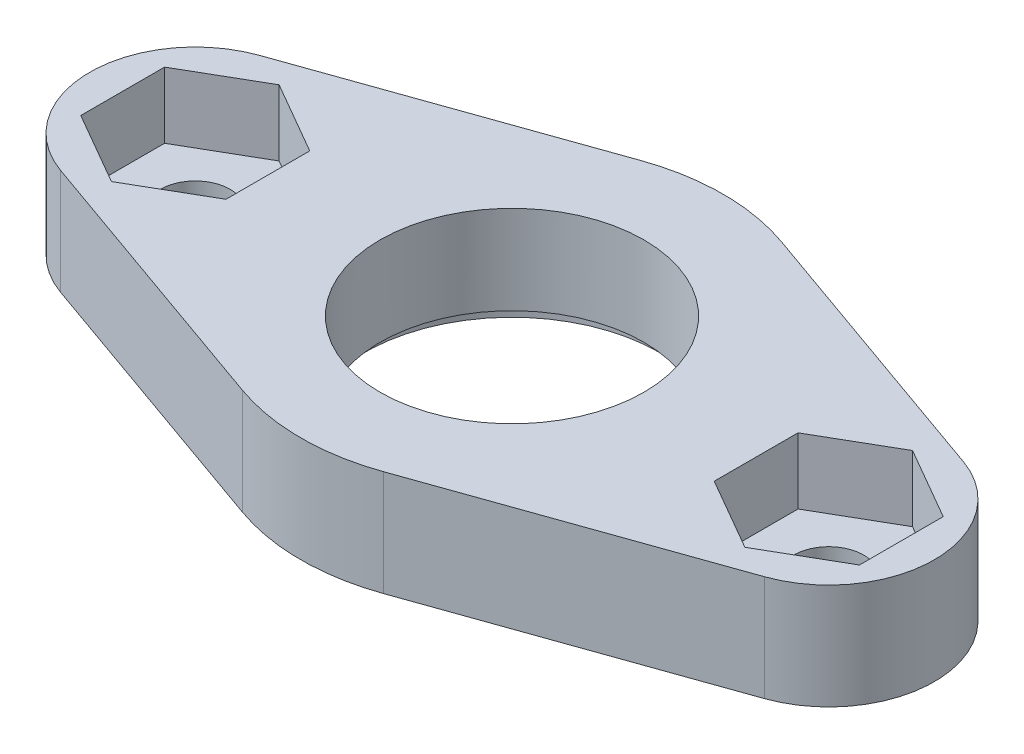
ISO-10303-21;
HEADER;
FILE_DESCRIPTION(('STEP AP214'),'2;1');
FILE_NAME('part.step','',(''),(''),'','','');
FILE_SCHEMA(('AUTOMOTIVE_DESIGN { 1 0 10303 214 1 1 1 1 }'));
ENDSEC;
DATA;
#1=APPLICATION_CONTEXT('core data for automotive mechanical design processes');
#2=APPLICATION_PROTOCOL_DEFINITION('international standard','automotive_design',2000,#1);
#3=PRODUCT_CONTEXT('',#1,'mechanical');
#4=PRODUCT('Part','Part','',(#3));
#5=PRODUCT_RELATED_PRODUCT_CATEGORY('part','',(#4));
#6=PRODUCT_DEFINITION_FORMATION('','',#4);
#7=PRODUCT_DEFINITION_CONTEXT('part definition',#1,'design');
#8=PRODUCT_DEFINITION('design','',#6,#7);
#9=PRODUCT_DEFINITION_SHAPE('','',#8);
#10=(LENGTH_UNIT() NAMED_UNIT(*) SI_UNIT(.MILLI.,.METRE.));
#11=(NAMED_UNIT(*) PLANE_ANGLE_UNIT() SI_UNIT($,.RADIAN.));
#12=(NAMED_UNIT(*) SI_UNIT($,.STERADIAN.) SOLID_ANGLE_UNIT());
#13=UNCERTAINTY_MEASURE_WITH_UNIT(LENGTH_MEASURE(1.E-05),#10,'distance_accuracy_value','');
#14=(GEOMETRIC_REPRESENTATION_CONTEXT(3) GLOBAL_UNCERTAINTY_ASSIGNED_CONTEXT((#13)) GLOBAL_UNIT_ASSIGNED_CONTEXT((#10,
#11,#12)) REPRESENTATION_CONTEXT('',''));
#15=CARTESIAN_POINT('',(0.,0.,0.));
#16=DIRECTION('',(0.,0.,1.));
#17=DIRECTION('',(1.,0.,0.));
#18=AXIS2_PLACEMENT_3D('',#15,#16,#17);
#19=CARTESIAN_POINT('',(19.05,6.35,0.));
#20=DIRECTION('',(0.,-1.,0.));
#21=DIRECTION('',(0.,0.,-1.));
#22=AXIS2_PLACEMENT_3D('',#19,#20,#21);
#23=CYLINDRICAL_SURFACE('',#22,2.0955);
#24=CARTESIAN_POINT('',(19.05,0.,0.));
#25=DIRECTION('',(0.,1.,0.));
#26=DIRECTION('',(0.,0.,1.));
#27=AXIS2_PLACEMENT_3D('',#24,#25,#26);
#28=CIRCLE('',#27,2.0955);
#29=CARTESIAN_POINT('',(19.05,0.,2.0955));
#30=VERTEX_POINT('',#29);
#31=EDGE_CURVE('E409',#30,#30,#28,.T.);
#32=ORIENTED_EDGE('',*,*,#31,.F.);
#33=EDGE_LOOP('',(#32));
#34=FACE_BOUND('',#33,.T.);
#35=CARTESIAN_POINT('',(19.05,2.38125,0.));
#36=DIRECTION('',(0.,1.,0.));
#37=DIRECTION('',(0.,0.,1.));
#38=AXIS2_PLACEMENT_3D('',#35,#36,#37);
#39=CIRCLE('',#38,2.0955);
#40=CARTESIAN_POINT('',(19.05,2.38125,2.0955));
#41=VERTEX_POINT('',#40);
#42=EDGE_CURVE('E48',#41,#41,#39,.T.);
#43=ORIENTED_EDGE('',*,*,#42,.T.);
#44=EDGE_LOOP('',(#43));
#45=FACE_BOUND('',#44,.T.);
#46=ADVANCED_FACE('F44',(#34,#45),#23,.F.);
#47=CARTESIAN_POINT('',(-19.05,6.35,0.));
#48=DIRECTION('',(0.,-1.,0.));
#49=DIRECTION('',(0.,0.,-1.));
#50=AXIS2_PLACEMENT_3D('',#47,#48,#49);
#51=CYLINDRICAL_SURFACE('',#50,2.0955);
#52=CARTESIAN_POINT('',(-19.05,0.,0.));
#53=DIRECTION('',(0.,1.,0.));
#54=DIRECTION('',(0.,0.,1.));
#55=AXIS2_PLACEMENT_3D('',#52,#53,#54);
#56=CIRCLE('',#55,2.0955);
#57=CARTESIAN_POINT('',(-19.05,0.,2.0955));
#58=VERTEX_POINT('',#57);
#59=EDGE_CURVE('E405',#58,#58,#56,.T.);
#60=ORIENTED_EDGE('',*,*,#59,.F.);
#61=EDGE_LOOP('',(#60));
#62=FACE_BOUND('',#61,.T.);
#63=CARTESIAN_POINT('',(-19.05,2.38125,0.));
#64=DIRECTION('',(0.,1.,0.));
#65=DIRECTION('',(0.,0.,1.));
#66=AXIS2_PLACEMENT_3D('',#63,#64,#65);
#67=CIRCLE('',#66,2.0955);
#68=CARTESIAN_POINT('',(-19.05,2.38125,2.0955));
#69=VERTEX_POINT('',#68);
#70=EDGE_CURVE('E287',#69,#69,#67,.T.);
#71=ORIENTED_EDGE('',*,*,#70,.T.);
#72=EDGE_LOOP('',(#71));
#73=FACE_BOUND('',#72,.T.);
#74=ADVANCED_FACE('F562',(#62,#73),#51,.F.);
#75=CARTESIAN_POINT('',(0.,6.35,0.));
#76=DIRECTION('',(0.,-1.,0.));
#77=DIRECTION('',(0.,0.,-1.));
#78=AXIS2_PLACEMENT_3D('',#75,#76,#77);
#79=CYLINDRICAL_SURFACE('',#78,7.9375);
#80=CARTESIAN_POINT('',(0.,6.35,0.));
#81=DIRECTION('',(0.,1.,0.));
#82=DIRECTION('',(0.,0.,1.));
#83=AXIS2_PLACEMENT_3D('',#80,#81,#82);
#84=CIRCLE('',#83,7.9375);
#85=CARTESIAN_POINT('',(0.,6.35,7.9375));
#86=VERTEX_POINT('',#85);
#87=EDGE_CURVE('E371',#86,#86,#84,.T.);
#88=ORIENTED_EDGE('',*,*,#87,.T.);
#89=EDGE_LOOP('',(#88));
#90=FACE_BOUND('',#89,.T.);
#91=CARTESIAN_POINT('',(0.,1.016,0.));
#92=DIRECTION('',(0.,-1.,0.));
#93=DIRECTION('',(0.,0.,-1.));
#94=AXIS2_PLACEMENT_3D('',#91,#92,#93);
#95=CIRCLE('',#94,7.9375);
#96=CARTESIAN_POINT('',(0.,1.016,-7.9375));
#97=VERTEX_POINT('',#96);
#98=EDGE_CURVE('E366',#97,#97,#95,.T.);
#99=ORIENTED_EDGE('',*,*,#98,.T.);
#100=EDGE_LOOP('',(#99));
#101=FACE_BOUND('',#100,.T.);
#102=ADVANCED_FACE('F46',(#90,#101),#79,.F.);
#103=CARTESIAN_POINT('',(-4.23333333333335,6.35,11.9736748280922));
#104=DIRECTION('',(0.333333333333334,0.,-0.942809041582063));
#105=DIRECTION('',(-0.942809041582063,0.,-0.333333333333334));
#106=AXIS2_PLACEMENT_3D('',#103,#104,#105);
#107=PLANE('',#106);
#108=DIRECTION('',(0.942809041582063,0.,0.333333333333334));
#109=VECTOR('',#108,1.);
#110=CARTESIAN_POINT('',(-4.23333333333335,0.,11.9736748280922));
#111=LINE('',#110,#109);
#112=CARTESIAN_POINT('',(-21.1666666666667,0.,5.9868374140461));
#113=VERTEX_POINT('',#112);
#114=CARTESIAN_POINT('',(-4.23333333333335,0.,11.9736748280922));
#115=VERTEX_POINT('',#114);
#116=EDGE_CURVE('E413',#113,#115,#111,.T.);
#117=ORIENTED_EDGE('',*,*,#116,.T.);
#118=DIRECTION('',(0.,-1.,0.));
#119=VECTOR('',#118,1.);
#120=CARTESIAN_POINT('',(-4.23333333333335,6.35,11.9736748280922));
#121=LINE('',#120,#119);
#122=CARTESIAN_POINT('',(-4.23333333333335,6.35,11.9736748280922));
#123=VERTEX_POINT('',#122);
#124=EDGE_CURVE('E11',#123,#115,#121,.T.);
#125=ORIENTED_EDGE('',*,*,#124,.F.);
#126=DIRECTION('',(0.942809041582063,0.,0.333333333333334));
#127=VECTOR('',#126,1.);
#128=CARTESIAN_POINT('',(-4.23333333333335,6.35,11.9736748280922));
#129=LINE('',#128,#127);
#130=CARTESIAN_POINT('',(-21.1666666666667,6.35,5.9868374140461));
#131=VERTEX_POINT('',#130);
#132=EDGE_CURVE('E375',#131,#123,#129,.T.);
#133=ORIENTED_EDGE('',*,*,#132,.F.);
#134=DIRECTION('',(0.,-1.,0.));
#135=VECTOR('',#134,1.);
#136=CARTESIAN_POINT('',(-21.1666666666667,6.35,5.9868374140461));
#137=LINE('',#136,#135);
#138=EDGE_CURVE('E404',#131,#113,#137,.T.);
#139=ORIENTED_EDGE('',*,*,#138,.T.);
#140=EDGE_LOOP('',(#117,#125,#133,#139));
#141=FACE_BOUND('',#140,.T.);
#142=ADVANCED_FACE('F521',(#141),#107,.F.);
#143=CARTESIAN_POINT('',(0.,6.35,0.));
#144=DIRECTION('',(0.,-1.,0.));
#145=DIRECTION('',(0.,0.,-1.));
#146=AXIS2_PLACEMENT_3D('',#143,#144,#145);
#147=CYLINDRICAL_SURFACE('',#146,12.7);
#148=CARTESIAN_POINT('',(0.,0.,0.));
#149=DIRECTION('',(0.,1.,0.));
#150=DIRECTION('',(0.,0.,1.));
#151=AXIS2_PLACEMENT_3D('',#148,#149,#150);
#152=CIRCLE('',#151,12.7);
#153=CARTESIAN_POINT('',(4.23333333333335,0.,11.9736748280922));
#154=VERTEX_POINT('',#153);
#155=EDGE_CURVE('E417',#115,#154,#152,.T.);
#156=ORIENTED_EDGE('',*,*,#155,.T.);
#157=DIRECTION('',(0.,-1.,0.));
#158=VECTOR('',#157,1.);
#159=CARTESIAN_POINT('',(4.23333333333335,6.35,11.9736748280922));
#160=LINE('',#159,#158);
#161=CARTESIAN_POINT('',(4.23333333333335,6.35,11.9736748280922));
#162=VERTEX_POINT('',#161);
#163=EDGE_CURVE('E54',#162,#154,#160,.T.);
#164=ORIENTED_EDGE('',*,*,#163,.F.);
#165=CARTESIAN_POINT('',(0.,6.35,0.));
#166=DIRECTION('',(0.,1.,0.));
#167=DIRECTION('',(0.,0.,1.));
#168=AXIS2_PLACEMENT_3D('',#165,#166,#167);
#169=CIRCLE('',#168,12.7);
#170=EDGE_CURVE('E380',#123,#162,#169,.T.);
#171=ORIENTED_EDGE('',*,*,#170,.F.);
#172=ORIENTED_EDGE('',*,*,#124,.T.);
#173=EDGE_LOOP('',(#156,#164,#171,#172));
#174=FACE_BOUND('',#173,.T.);
#175=ADVANCED_FACE('F524',(#174),#147,.T.);
#176=CARTESIAN_POINT('',(4.23333333333335,6.35,11.9736748280922));
#177=DIRECTION('',(0.333333333333334,0.,0.942809041582063));
#178=DIRECTION('',(0.942809041582063,0.,-0.333333333333334));
#179=AXIS2_PLACEMENT_3D('',#176,#177,#178);
#180=PLANE('',#179);
#181=DIRECTION('',(-0.942809041582063,0.,0.333333333333334));
#182=VECTOR('',#181,1.);
#183=CARTESIAN_POINT('',(4.23333333333335,0.,11.9736748280922));
#184=LINE('',#183,#182);
#185=CARTESIAN_POINT('',(21.1666666666667,0.,5.9868374140461));
#186=VERTEX_POINT('',#185);
#187=EDGE_CURVE('E421',#186,#154,#184,.T.);
#188=ORIENTED_EDGE('',*,*,#187,.F.);
#189=DIRECTION('',(0.,-1.,0.));
#190=VECTOR('',#189,1.);
#191=CARTESIAN_POINT('',(21.1666666666667,6.35,5.9868374140461));
#192=LINE('',#191,#190);
#193=CARTESIAN_POINT('',(21.1666666666667,6.35,5.9868374140461));
#194=VERTEX_POINT('',#193);
#195=EDGE_CURVE('E458',#194,#186,#192,.T.);
#196=ORIENTED_EDGE('',*,*,#195,.F.);
#197=DIRECTION('',(-0.942809041582063,0.,0.333333333333334));
#198=VECTOR('',#197,1.);
#199=CARTESIAN_POINT('',(4.23333333333335,6.35,11.9736748280922));
#200=LINE('',#199,#198);
#201=EDGE_CURVE('E383',#194,#162,#200,.T.);
#202=ORIENTED_EDGE('',*,*,#201,.T.);
#203=ORIENTED_EDGE('',*,*,#163,.T.);
#204=EDGE_LOOP('',(#188,#196,#202,#203));
#205=FACE_BOUND('',#204,.T.);
#206=ADVANCED_FACE('F527',(#205),#180,.T.);
#207=CARTESIAN_POINT('',(19.05,6.35,0.));
#208=DIRECTION('',(0.,-1.,0.));
#209=DIRECTION('',(0.,0.,-1.));
#210=AXIS2_PLACEMENT_3D('',#207,#208,#209);
#211=CYLINDRICAL_SURFACE('',#210,6.35);
#212=CARTESIAN_POINT('',(19.05,0.,0.));
#213=DIRECTION('',(0.,1.,0.));
#214=DIRECTION('',(0.,0.,1.));
#215=AXIS2_PLACEMENT_3D('',#212,#213,#214);
#216=CIRCLE('',#215,6.35);
#217=CARTESIAN_POINT('',(21.1666666666667,0.,-5.9868374140461));
#218=VERTEX_POINT('',#217);
#219=EDGE_CURVE('E425',#186,#218,#216,.T.);
#220=ORIENTED_EDGE('',*,*,#219,.T.);
#221=DIRECTION('',(0.,-1.,0.));
#222=VECTOR('',#221,1.);
#223=CARTESIAN_POINT('',(21.1666666666667,6.35,-5.9868374140461));
#224=LINE('',#223,#222);
#225=CARTESIAN_POINT('',(21.1666666666667,6.35,-5.9868374140461));
#226=VERTEX_POINT('',#225);
#227=EDGE_CURVE('E455',#226,#218,#224,.T.);
#228=ORIENTED_EDGE('',*,*,#227,.F.);
#229=CARTESIAN_POINT('',(19.05,6.35,0.));
#230=DIRECTION('',(0.,1.,0.));
#231=DIRECTION('',(0.,0.,1.));
#232=AXIS2_PLACEMENT_3D('',#229,#230,#231);
#233=CIRCLE('',#232,6.35);
#234=EDGE_CURVE('E387',#194,#226,#233,.T.);
#235=ORIENTED_EDGE('',*,*,#234,.F.);
#236=ORIENTED_EDGE('',*,*,#195,.T.);
#237=EDGE_LOOP('',(#220,#228,#235,#236));
#238=FACE_BOUND('',#237,.T.);
#239=ADVANCED_FACE('F532',(#238),#211,.T.);
#240=CARTESIAN_POINT('',(4.23333333333335,6.35,-11.9736748280922));
#241=DIRECTION('',(0.333333333333334,0.,-0.942809041582063));
#242=DIRECTION('',(-0.942809041582063,0.,-0.333333333333334));
#243=AXIS2_PLACEMENT_3D('',#240,#241,#242);
#244=PLANE('',#243);
#245=DIRECTION('',(0.942809041582063,0.,0.333333333333334));
#246=VECTOR('',#245,1.);
#247=CARTESIAN_POINT('',(4.23333333333335,0.,-11.9736748280922));
#248=LINE('',#247,#246);
#249=CARTESIAN_POINT('',(4.23333333333335,0.,-11.9736748280922));
#250=VERTEX_POINT('',#249);
#251=EDGE_CURVE('E429',#250,#218,#248,.T.);
#252=ORIENTED_EDGE('',*,*,#251,.F.);
#253=DIRECTION('',(0.,-1.,0.));
#254=VECTOR('',#253,1.);
#255=CARTESIAN_POINT('',(4.23333333333335,6.35,-11.9736748280922));
#256=LINE('',#255,#254);
#257=CARTESIAN_POINT('',(4.23333333333335,6.35,-11.9736748280922));
#258=VERTEX_POINT('',#257);
#259=EDGE_CURVE('E452',#258,#250,#256,.T.);
#260=ORIENTED_EDGE('',*,*,#259,.F.);
#261=DIRECTION('',(0.942809041582063,0.,0.333333333333334));
#262=VECTOR('',#261,1.);
#263=CARTESIAN_POINT('',(4.23333333333335,6.35,-11.9736748280922));
#264=LINE('',#263,#262);
#265=EDGE_CURVE('E390',#258,#226,#264,.T.);
#266=ORIENTED_EDGE('',*,*,#265,.T.);
#267=ORIENTED_EDGE('',*,*,#227,.T.);
#268=EDGE_LOOP('',(#252,#260,#266,#267));
#269=FACE_BOUND('',#268,.T.);
#270=ADVANCED_FACE('F536',(#269),#244,.T.);
#271=CARTESIAN_POINT('',(0.,6.35,0.));
#272=DIRECTION('',(0.,-1.,0.));
#273=DIRECTION('',(0.,0.,-1.));
#274=AXIS2_PLACEMENT_3D('',#271,#272,#273);
#275=CYLINDRICAL_SURFACE('',#274,12.7);
#276=CARTESIAN_POINT('',(0.,0.,0.));
#277=DIRECTION('',(0.,1.,0.));
#278=DIRECTION('',(0.,0.,1.));
#279=AXIS2_PLACEMENT_3D('',#276,#277,#278);
#280=CIRCLE('',#279,12.7);
#281=CARTESIAN_POINT('',(-4.23333333333335,0.,-11.9736748280922));
#282=VERTEX_POINT('',#281);
#283=EDGE_CURVE('E433',#250,#282,#280,.T.);
#284=ORIENTED_EDGE('',*,*,#283,.T.);
#285=DIRECTION('',(0.,-1.,0.));
#286=VECTOR('',#285,1.);
#287=CARTESIAN_POINT('',(-4.23333333333335,6.35,-11.9736748280922));
#288=LINE('',#287,#286);
#289=CARTESIAN_POINT('',(-4.23333333333335,6.35,-11.9736748280922));
#290=VERTEX_POINT('',#289);
#291=EDGE_CURVE('E449',#290,#282,#288,.T.);
#292=ORIENTED_EDGE('',*,*,#291,.F.);
#293=CARTESIAN_POINT('',(0.,6.35,0.));
#294=DIRECTION('',(0.,1.,0.));
#295=DIRECTION('',(0.,0.,1.));
#296=AXIS2_PLACEMENT_3D('',#293,#294,#295);
#297=CIRCLE('',#296,12.7);
#298=EDGE_CURVE('E394',#258,#290,#297,.T.);
#299=ORIENTED_EDGE('',*,*,#298,.F.);
#300=ORIENTED_EDGE('',*,*,#259,.T.);
#301=EDGE_LOOP('',(#284,#292,#299,#300));
#302=FACE_BOUND('',#301,.T.);
#303=ADVANCED_FACE('F541',(#302),#275,.T.);
#304=CARTESIAN_POINT('',(-4.23333333333335,6.35,-11.9736748280922));
#305=DIRECTION('',(-0.333333333333334,0.,-0.942809041582063));
#306=DIRECTION('',(-0.942809041582063,0.,0.333333333333334));
#307=AXIS2_PLACEMENT_3D('',#304,#305,#306);
#308=PLANE('',#307);
#309=DIRECTION('',(0.942809041582063,0.,-0.333333333333334));
#310=VECTOR('',#309,1.);
#311=CARTESIAN_POINT('',(-4.23333333333335,0.,-11.9736748280922));
#312=LINE('',#311,#310);
#313=CARTESIAN_POINT('',(-21.1666666666667,0.,-5.9868374140461));
#314=VERTEX_POINT('',#313);
#315=EDGE_CURVE('E437',#314,#282,#312,.T.);
#316=ORIENTED_EDGE('',*,*,#315,.F.);
#317=DIRECTION('',(0.,-1.,0.));
#318=VECTOR('',#317,1.);
#319=CARTESIAN_POINT('',(-21.1666666666667,6.35,-5.9868374140461));
#320=LINE('',#319,#318);
#321=CARTESIAN_POINT('',(-21.1666666666667,6.35,-5.9868374140461));
#322=VERTEX_POINT('',#321);
#323=EDGE_CURVE('E446',#322,#314,#320,.T.);
#324=ORIENTED_EDGE('',*,*,#323,.F.);
#325=DIRECTION('',(0.942809041582063,0.,-0.333333333333334));
#326=VECTOR('',#325,1.);
#327=CARTESIAN_POINT('',(-4.23333333333335,6.35,-11.9736748280922));
#328=LINE('',#327,#326);
#329=EDGE_CURVE('E397',#322,#290,#328,.T.);
#330=ORIENTED_EDGE('',*,*,#329,.T.);
#331=ORIENTED_EDGE('',*,*,#291,.T.);
#332=EDGE_LOOP('',(#316,#324,#330,#331));
#333=FACE_BOUND('',#332,.T.);
#334=ADVANCED_FACE('F544',(#333),#308,.T.);
#335=CARTESIAN_POINT('',(-19.05,6.35,0.));
#336=DIRECTION('',(0.,-1.,0.));
#337=DIRECTION('',(0.,0.,-1.));
#338=AXIS2_PLACEMENT_3D('',#335,#336,#337);
#339=CYLINDRICAL_SURFACE('',#338,6.35);
#340=CARTESIAN_POINT('',(-19.05,0.,0.));
#341=DIRECTION('',(0.,1.,0.));
#342=DIRECTION('',(0.,0.,1.));
#343=AXIS2_PLACEMENT_3D('',#340,#341,#342);
#344=CIRCLE('',#343,6.35);
#345=EDGE_CURVE('E376',#314,#113,#344,.T.);
#346=ORIENTED_EDGE('',*,*,#345,.T.);
#347=ORIENTED_EDGE('',*,*,#138,.F.);
#348=CARTESIAN_POINT('',(-19.05,6.35,0.));
#349=DIRECTION('',(0.,1.,0.));
#350=DIRECTION('',(0.,0.,1.));
#351=AXIS2_PLACEMENT_3D('',#348,#349,#350);
#352=CIRCLE('',#351,6.35);
#353=EDGE_CURVE('E401',#322,#131,#352,.T.);
#354=ORIENTED_EDGE('',*,*,#353,.F.);
#355=ORIENTED_EDGE('',*,*,#323,.T.);
#356=EDGE_LOOP('',(#346,#347,#354,#355));
#357=FACE_BOUND('',#356,.T.);
#358=ADVANCED_FACE('F508',(#357),#339,.T.);
#359=CARTESIAN_POINT('',(0.,6.35,0.));
#360=DIRECTION('',(0.,1.,0.));
#361=DIRECTION('',(0.,0.,1.));
#362=AXIS2_PLACEMENT_3D('',#359,#360,#361);
#363=PLANE('',#362);
#364=DIRECTION('',(-0.866025403784438,0.,0.5));
#365=VECTOR('',#364,1.);
#366=CARTESIAN_POINT('',(-19.05,6.35,-5.04098953786192));
#367=LINE('',#366,#365);
#368=CARTESIAN_POINT('',(-19.05,6.35,-5.04098953786192));
#369=VERTEX_POINT('',#368);
#370=CARTESIAN_POINT('',(-23.415625,6.35,-2.52049476893096));
#371=VERTEX_POINT('',#370);
#372=EDGE_CURVE('E65',#369,#371,#367,.T.);
#373=ORIENTED_EDGE('',*,*,#372,.F.);
#374=DIRECTION('',(-0.866025403784439,0.,-0.5));
#375=VECTOR('',#374,1.);
#376=CARTESIAN_POINT('',(-14.684375,6.35,-2.52049476893096));
#377=LINE('',#376,#375);
#378=CARTESIAN_POINT('',(-14.684375,6.35,-2.52049476893096));
#379=VERTEX_POINT('',#378);
#380=EDGE_CURVE('E248',#379,#369,#377,.T.);
#381=ORIENTED_EDGE('',*,*,#380,.F.);
#382=DIRECTION('',(0.,0.,-1.));
#383=VECTOR('',#382,1.);
#384=CARTESIAN_POINT('',(-14.684375,6.35,2.52049476893096));
#385=LINE('',#384,#383);
#386=CARTESIAN_POINT('',(-14.684375,6.35,2.52049476893096));
#387=VERTEX_POINT('',#386);
#388=EDGE_CURVE('E254',#387,#379,#385,.T.);
#389=ORIENTED_EDGE('',*,*,#388,.F.);
#390=DIRECTION('',(0.866025403784438,0.,-0.5));
#391=VECTOR('',#390,1.);
#392=CARTESIAN_POINT('',(-19.05,6.35,5.04098953786192));
#393=LINE('',#392,#391);
#394=CARTESIAN_POINT('',(-19.05,6.35,5.04098953786192));
#395=VERTEX_POINT('',#394);
#396=EDGE_CURVE('E278',#395,#387,#393,.T.);
#397=ORIENTED_EDGE('',*,*,#396,.F.);
#398=DIRECTION('',(0.866025403784439,0.,0.5));
#399=VECTOR('',#398,1.);
#400=CARTESIAN_POINT('',(-23.415625,6.35,2.52049476893096));
#401=LINE('',#400,#399);
#402=CARTESIAN_POINT('',(-23.415625,6.35,2.52049476893096));
#403=VERTEX_POINT('',#402);
#404=EDGE_CURVE('E274',#403,#395,#401,.T.);
#405=ORIENTED_EDGE('',*,*,#404,.F.);
#406=DIRECTION('',(0.,0.,1.));
#407=VECTOR('',#406,1.);
#408=CARTESIAN_POINT('',(-23.415625,6.35,-2.52049476893096));
#409=LINE('',#408,#407);
#410=EDGE_CURVE('E270',#371,#403,#409,.T.);
#411=ORIENTED_EDGE('',*,*,#410,.F.);
#412=EDGE_LOOP('',(#373,#381,#389,#397,#405,#411));
#413=FACE_BOUND('',#412,.T.);
#414=DIRECTION('',(-0.866025403784439,0.,-0.5));
#415=VECTOR('',#414,1.);
#416=CARTESIAN_POINT('',(23.415625,6.35,-2.52049476893097));
#417=LINE('',#416,#415);
#418=CARTESIAN_POINT('',(23.415625,6.35,-2.52049476893097));
#419=VERTEX_POINT('',#418);
#420=CARTESIAN_POINT('',(19.05,6.35,-5.04098953786192));
#421=VERTEX_POINT('',#420);
#422=EDGE_CURVE('E76',#419,#421,#417,.T.);
#423=ORIENTED_EDGE('',*,*,#422,.F.);
#424=DIRECTION('',(0.,0.,-1.));
#425=VECTOR('',#424,1.);
#426=CARTESIAN_POINT('',(23.415625,6.35,2.52049476893095));
#427=LINE('',#426,#425);
#428=CARTESIAN_POINT('',(23.415625,6.35,2.52049476893095));
#429=VERTEX_POINT('',#428);
#430=EDGE_CURVE('E304',#429,#419,#427,.T.);
#431=ORIENTED_EDGE('',*,*,#430,.F.);
#432=DIRECTION('',(0.866025403784439,0.,-0.5));
#433=VECTOR('',#432,1.);
#434=CARTESIAN_POINT('',(19.05,6.35,5.04098953786191));
#435=LINE('',#434,#433);
#436=CARTESIAN_POINT('',(19.05,6.35,5.04098953786191));
#437=VERTEX_POINT('',#436);
#438=EDGE_CURVE('E339',#437,#429,#435,.T.);
#439=ORIENTED_EDGE('',*,*,#438,.F.);
#440=DIRECTION('',(0.866025403784439,0.,0.499999999999999));
#441=VECTOR('',#440,1.);
#442=CARTESIAN_POINT('',(14.684375,6.35,2.52049476893096));
#443=LINE('',#442,#441);
#444=CARTESIAN_POINT('',(14.684375,6.35,2.52049476893096));
#445=VERTEX_POINT('',#444);
#446=EDGE_CURVE('E335',#445,#437,#443,.T.);
#447=ORIENTED_EDGE('',*,*,#446,.F.);
#448=DIRECTION('',(0.,0.,1.));
#449=VECTOR('',#448,1.);
#450=CARTESIAN_POINT('',(14.684375,6.35,-2.52049476893096));
#451=LINE('',#450,#449);
#452=CARTESIAN_POINT('',(14.684375,6.35,-2.52049476893096));
#453=VERTEX_POINT('',#452);
#454=EDGE_CURVE('E331',#453,#445,#451,.T.);
#455=ORIENTED_EDGE('',*,*,#454,.F.);
#456=DIRECTION('',(-0.866025403784439,0.,0.5));
#457=VECTOR('',#456,1.);
#458=CARTESIAN_POINT('',(19.05,6.35,-5.04098953786192));
#459=LINE('',#458,#457);
#460=EDGE_CURVE('E327',#421,#453,#459,.T.);
#461=ORIENTED_EDGE('',*,*,#460,.F.);
#462=EDGE_LOOP('',(#423,#431,#439,#447,#455,#461));
#463=FACE_BOUND('',#462,.T.);
#464=ORIENTED_EDGE('',*,*,#87,.F.);
#465=EDGE_LOOP('',(#464));
#466=FACE_BOUND('',#465,.T.);
#467=ORIENTED_EDGE('',*,*,#132,.T.);
#468=ORIENTED_EDGE('',*,*,#170,.T.);
#469=ORIENTED_EDGE('',*,*,#201,.F.);
#470=ORIENTED_EDGE('',*,*,#234,.T.);
#471=ORIENTED_EDGE('',*,*,#265,.F.);
#472=ORIENTED_EDGE('',*,*,#298,.T.);
#473=ORIENTED_EDGE('',*,*,#329,.F.);
#474=ORIENTED_EDGE('',*,*,#353,.T.);
#475=EDGE_LOOP('',(#467,#468,#469,#470,#471,#472,#473,#474));
#476=FACE_BOUND('',#475,.T.);
#477=ADVANCED_FACE('F504',(#413,#463,#466,#476),#363,.T.);
#478=CARTESIAN_POINT('',(0.,0.,0.));
#479=DIRECTION('',(0.,1.,0.));
#480=DIRECTION('',(0.,0.,1.));
#481=AXIS2_PLACEMENT_3D('',#478,#479,#480);
#482=PLANE('',#481);
#483=CARTESIAN_POINT('',(0.,0.,0.));
#484=DIRECTION('',(0.,-1.,0.));
#485=DIRECTION('',(0.,0.,-1.));
#486=AXIS2_PLACEMENT_3D('',#483,#484,#485);
#487=CIRCLE('',#486,8.89);
#488=CARTESIAN_POINT('',(0.,0.,-8.89));
#489=VERTEX_POINT('',#488);
#490=EDGE_CURVE('E367',#489,#489,#487,.T.);
#491=ORIENTED_EDGE('',*,*,#490,.F.);
#492=EDGE_LOOP('',(#491));
#493=FACE_BOUND('',#492,.T.);
#494=ORIENTED_EDGE('',*,*,#59,.T.);
#495=EDGE_LOOP('',(#494));
#496=FACE_BOUND('',#495,.T.);
#497=ORIENTED_EDGE('',*,*,#31,.T.);
#498=EDGE_LOOP('',(#497));
#499=FACE_BOUND('',#498,.T.);
#500=ORIENTED_EDGE('',*,*,#116,.F.);
#501=ORIENTED_EDGE('',*,*,#345,.F.);
#502=ORIENTED_EDGE('',*,*,#315,.T.);
#503=ORIENTED_EDGE('',*,*,#283,.F.);
#504=ORIENTED_EDGE('',*,*,#251,.T.);
#505=ORIENTED_EDGE('',*,*,#219,.F.);
#506=ORIENTED_EDGE('',*,*,#187,.T.);
#507=ORIENTED_EDGE('',*,*,#155,.F.);
#508=EDGE_LOOP('',(#500,#501,#502,#503,#504,#505,#506,#507));
#509=FACE_BOUND('',#508,.T.);
#510=ADVANCED_FACE('F507',(#493,#496,#499,#509),#482,.F.);
#511=CARTESIAN_POINT('',(0.,1.016,0.));
#512=DIRECTION('',(0.,-1.,0.));
#513=DIRECTION('',(0.,0.,-1.));
#514=AXIS2_PLACEMENT_3D('',#511,#512,#513);
#515=CYLINDRICAL_SURFACE('',#514,8.89);
#516=CARTESIAN_POINT('',(0.,1.016,0.));
#517=DIRECTION('',(0.,-1.,0.));
#518=DIRECTION('',(0.,0.,-1.));
#519=AXIS2_PLACEMENT_3D('',#516,#517,#518);
#520=CIRCLE('',#519,8.89);
#521=CARTESIAN_POINT('',(0.,1.016,-8.89));
#522=VERTEX_POINT('',#521);
#523=EDGE_CURVE('E362',#522,#522,#520,.T.);
#524=ORIENTED_EDGE('',*,*,#523,.F.);
#525=EDGE_LOOP('',(#524));
#526=FACE_BOUND('',#525,.T.);
#527=ORIENTED_EDGE('',*,*,#490,.T.);
#528=EDGE_LOOP('',(#527));
#529=FACE_BOUND('',#528,.T.);
#530=ADVANCED_FACE('F549',(#526,#529),#515,.F.);
#531=CARTESIAN_POINT('',(0.,1.016,0.));
#532=DIRECTION('',(0.,-1.,0.));
#533=DIRECTION('',(0.,0.,-1.));
#534=AXIS2_PLACEMENT_3D('',#531,#532,#533);
#535=PLANE('',#534);
#536=ORIENTED_EDGE('',*,*,#98,.F.);
#537=EDGE_LOOP('',(#536));
#538=FACE_BOUND('',#537,.T.);
#539=ORIENTED_EDGE('',*,*,#523,.T.);
#540=EDGE_LOOP('',(#539));
#541=FACE_BOUND('',#540,.T.);
#542=ADVANCED_FACE('F555',(#538,#541),#535,.T.);
#543=CARTESIAN_POINT('',(23.415625,2.38125,-2.52049476893097));
#544=DIRECTION('',(0.5,0.,-0.866025403784439));
#545=DIRECTION('',(-0.866025403784439,0.,-0.5));
#546=AXIS2_PLACEMENT_3D('',#543,#544,#545);
#547=PLANE('',#546);
#548=ORIENTED_EDGE('',*,*,#422,.T.);
#549=DIRECTION('',(0.,1.,0.));
#550=VECTOR('',#549,1.);
#551=CARTESIAN_POINT('',(19.05,2.38125,-5.04098953786192));
#552=LINE('',#551,#550);
#553=CARTESIAN_POINT('',(19.05,2.38125,-5.04098953786192));
#554=VERTEX_POINT('',#553);
#555=EDGE_CURVE('E324',#554,#421,#552,.T.);
#556=ORIENTED_EDGE('',*,*,#555,.F.);
#557=DIRECTION('',(-0.866025403784439,0.,-0.5));
#558=VECTOR('',#557,1.);
#559=CARTESIAN_POINT('',(23.415625,2.38125,-2.52049476893097));
#560=LINE('',#559,#558);
#561=CARTESIAN_POINT('',(23.415625,2.38125,-2.52049476893097));
#562=VERTEX_POINT('',#561);
#563=EDGE_CURVE('E299',#562,#554,#560,.T.);
#564=ORIENTED_EDGE('',*,*,#563,.F.);
#565=DIRECTION('',(0.,1.,0.));
#566=VECTOR('',#565,1.);
#567=CARTESIAN_POINT('',(23.415625,2.38125,-2.52049476893097));
#568=LINE('',#567,#566);
#569=EDGE_CURVE('E271',#562,#419,#568,.T.);
#570=ORIENTED_EDGE('',*,*,#569,.T.);
#571=EDGE_LOOP('',(#548,#556,#564,#570));
#572=FACE_BOUND('',#571,.T.);
#573=ADVANCED_FACE('F485',(#572),#547,.F.);
#574=CARTESIAN_POINT('',(23.415625,2.38125,2.52049476893095));
#575=DIRECTION('',(1.,0.,0.));
#576=DIRECTION('',(0.,0.,-1.));
#577=AXIS2_PLACEMENT_3D('',#574,#575,#576);
#578=PLANE('',#577);
#579=ORIENTED_EDGE('',*,*,#430,.T.);
#580=ORIENTED_EDGE('',*,*,#569,.F.);
#581=DIRECTION('',(0.,0.,-1.));
#582=VECTOR('',#581,1.);
#583=CARTESIAN_POINT('',(23.415625,2.38125,2.52049476893095));
#584=LINE('',#583,#582);
#585=CARTESIAN_POINT('',(23.415625,2.38125,2.52049476893095));
#586=VERTEX_POINT('',#585);
#587=EDGE_CURVE('E320',#586,#562,#584,.T.);
#588=ORIENTED_EDGE('',*,*,#587,.F.);
#589=DIRECTION('',(0.,1.,0.));
#590=VECTOR('',#589,1.);
#591=CARTESIAN_POINT('',(23.415625,2.38125,2.52049476893095));
#592=LINE('',#591,#590);
#593=EDGE_CURVE('E348',#586,#429,#592,.T.);
#594=ORIENTED_EDGE('',*,*,#593,.T.);
#595=EDGE_LOOP('',(#579,#580,#588,#594));
#596=FACE_BOUND('',#595,.T.);
#597=ADVANCED_FACE('F502',(#596),#578,.F.);
#598=CARTESIAN_POINT('',(19.05,2.38125,5.04098953786191));
#599=DIRECTION('',(0.5,0.,0.866025403784439));
#600=DIRECTION('',(0.866025403784439,0.,-0.5));
#601=AXIS2_PLACEMENT_3D('',#598,#599,#600);
#602=PLANE('',#601);
#603=ORIENTED_EDGE('',*,*,#438,.T.);
#604=ORIENTED_EDGE('',*,*,#593,.F.);
#605=DIRECTION('',(0.866025403784439,0.,-0.5));
#606=VECTOR('',#605,1.);
#607=CARTESIAN_POINT('',(19.05,2.38125,5.04098953786191));
#608=LINE('',#607,#606);
#609=CARTESIAN_POINT('',(19.05,2.38125,5.04098953786191));
#610=VERTEX_POINT('',#609);
#611=EDGE_CURVE('E316',#610,#586,#608,.T.);
#612=ORIENTED_EDGE('',*,*,#611,.F.);
#613=DIRECTION('',(0.,1.,0.));
#614=VECTOR('',#613,1.);
#615=CARTESIAN_POINT('',(19.05,2.38125,5.04098953786191));
#616=LINE('',#615,#614);
#617=EDGE_CURVE('E351',#610,#437,#616,.T.);
#618=ORIENTED_EDGE('',*,*,#617,.T.);
#619=EDGE_LOOP('',(#603,#604,#612,#618));
#620=FACE_BOUND('',#619,.T.);
#621=ADVANCED_FACE('F499',(#620),#602,.F.);
#622=CARTESIAN_POINT('',(14.684375,2.38125,2.52049476893096));
#623=DIRECTION('',(-0.499999999999999,0.,0.866025403784439));
#624=DIRECTION('',(0.866025403784439,0.,0.499999999999999));
#625=AXIS2_PLACEMENT_3D('',#622,#623,#624);
#626=PLANE('',#625);
#627=ORIENTED_EDGE('',*,*,#446,.T.);
#628=ORIENTED_EDGE('',*,*,#617,.F.);
#629=DIRECTION('',(0.866025403784439,0.,0.499999999999999));
#630=VECTOR('',#629,1.);
#631=CARTESIAN_POINT('',(14.684375,2.38125,2.52049476893096));
#632=LINE('',#631,#630);
#633=CARTESIAN_POINT('',(14.684375,2.38125,2.52049476893096));
#634=VERTEX_POINT('',#633);
#635=EDGE_CURVE('E312',#634,#610,#632,.T.);
#636=ORIENTED_EDGE('',*,*,#635,.F.);
#637=DIRECTION('',(0.,1.,0.));
#638=VECTOR('',#637,1.);
#639=CARTESIAN_POINT('',(14.684375,2.38125,2.52049476893096));
#640=LINE('',#639,#638);
#641=EDGE_CURVE('E354',#634,#445,#640,.T.);
#642=ORIENTED_EDGE('',*,*,#641,.T.);
#643=EDGE_LOOP('',(#627,#628,#636,#642));
#644=FACE_BOUND('',#643,.T.);
#645=ADVANCED_FACE('F495',(#644),#626,.F.);
#646=CARTESIAN_POINT('',(14.684375,2.38125,-2.52049476893096));
#647=DIRECTION('',(-1.,0.,0.));
#648=DIRECTION('',(0.,0.,1.));
#649=AXIS2_PLACEMENT_3D('',#646,#647,#648);
#650=PLANE('',#649);
#651=ORIENTED_EDGE('',*,*,#454,.T.);
#652=ORIENTED_EDGE('',*,*,#641,.F.);
#653=DIRECTION('',(0.,0.,1.));
#654=VECTOR('',#653,1.);
#655=CARTESIAN_POINT('',(14.684375,2.38125,-2.52049476893096));
#656=LINE('',#655,#654);
#657=CARTESIAN_POINT('',(14.684375,2.38125,-2.52049476893096));
#658=VERTEX_POINT('',#657);
#659=EDGE_CURVE('E308',#658,#634,#656,.T.);
#660=ORIENTED_EDGE('',*,*,#659,.F.);
#661=DIRECTION('',(0.,1.,0.));
#662=VECTOR('',#661,1.);
#663=CARTESIAN_POINT('',(14.684375,2.38125,-2.52049476893096));
#664=LINE('',#663,#662);
#665=EDGE_CURVE('E357',#658,#453,#664,.T.);
#666=ORIENTED_EDGE('',*,*,#665,.T.);
#667=EDGE_LOOP('',(#651,#652,#660,#666));
#668=FACE_BOUND('',#667,.T.);
#669=ADVANCED_FACE('F491',(#668),#650,.F.);
#670=CARTESIAN_POINT('',(19.05,2.38125,-5.04098953786192));
#671=DIRECTION('',(-0.5,0.,-0.866025403784439));
#672=DIRECTION('',(-0.866025403784439,0.,0.5));
#673=AXIS2_PLACEMENT_3D('',#670,#671,#672);
#674=PLANE('',#673);
#675=ORIENTED_EDGE('',*,*,#460,.T.);
#676=ORIENTED_EDGE('',*,*,#665,.F.);
#677=DIRECTION('',(-0.866025403784439,0.,0.5));
#678=VECTOR('',#677,1.);
#679=CARTESIAN_POINT('',(19.05,2.38125,-5.04098953786192));
#680=LINE('',#679,#678);
#681=EDGE_CURVE('E303',#554,#658,#680,.T.);
#682=ORIENTED_EDGE('',*,*,#681,.F.);
#683=ORIENTED_EDGE('',*,*,#555,.T.);
#684=EDGE_LOOP('',(#675,#676,#682,#683));
#685=FACE_BOUND('',#684,.T.);
#686=ADVANCED_FACE('F480',(#685),#674,.F.);
#687=CARTESIAN_POINT('',(0.,2.38125,0.));
#688=DIRECTION('',(0.,1.,0.));
#689=DIRECTION('',(0.,0.,1.));
#690=AXIS2_PLACEMENT_3D('',#687,#688,#689);
#691=PLANE('',#690);
#692=ORIENTED_EDGE('',*,*,#42,.F.);
#693=EDGE_LOOP('',(#692));
#694=FACE_BOUND('',#693,.T.);
#695=ORIENTED_EDGE('',*,*,#563,.T.);
#696=ORIENTED_EDGE('',*,*,#681,.T.);
#697=ORIENTED_EDGE('',*,*,#659,.T.);
#698=ORIENTED_EDGE('',*,*,#635,.T.);
#699=ORIENTED_EDGE('',*,*,#611,.T.);
#700=ORIENTED_EDGE('',*,*,#587,.T.);
#701=EDGE_LOOP('',(#695,#696,#697,#698,#699,#700));
#702=FACE_BOUND('',#701,.T.);
#703=ADVANCED_FACE('F477',(#694,#702),#691,.T.);
#704=CARTESIAN_POINT('',(-19.05,2.38125,-5.04098953786192));
#705=DIRECTION('',(-0.5,0.,-0.866025403784438));
#706=DIRECTION('',(-0.866025403784439,0.,0.5));
#707=AXIS2_PLACEMENT_3D('',#704,#705,#706);
#708=PLANE('',#707);
#709=ORIENTED_EDGE('',*,*,#372,.T.);
#710=DIRECTION('',(0.,1.,0.));
#711=VECTOR('',#710,1.);
#712=CARTESIAN_POINT('',(-23.415625,2.38125,-2.52049476893096));
#713=LINE('',#712,#711);
#714=CARTESIAN_POINT('',(-23.415625,2.38125,-2.52049476893096));
#715=VERTEX_POINT('',#714);
#716=EDGE_CURVE('E222',#715,#371,#713,.T.);
#717=ORIENTED_EDGE('',*,*,#716,.F.);
#718=DIRECTION('',(-0.866025403784438,0.,0.5));
#719=VECTOR('',#718,1.);
#720=CARTESIAN_POINT('',(-19.05,2.38125,-5.04098953786192));
#721=LINE('',#720,#719);
#722=CARTESIAN_POINT('',(-19.05,2.38125,-5.04098953786192));
#723=VERTEX_POINT('',#722);
#724=EDGE_CURVE('E226',#723,#715,#721,.T.);
#725=ORIENTED_EDGE('',*,*,#724,.F.);
#726=DIRECTION('',(0.,1.,0.));
#727=VECTOR('',#726,1.);
#728=CARTESIAN_POINT('',(-19.05,2.38125,-5.04098953786192));
#729=LINE('',#728,#727);
#730=EDGE_CURVE('E285',#723,#369,#729,.T.);
#731=ORIENTED_EDGE('',*,*,#730,.T.);
#732=EDGE_LOOP('',(#709,#717,#725,#731));
#733=FACE_BOUND('',#732,.T.);
#734=ADVANCED_FACE('F224',(#733),#708,.F.);
#735=CARTESIAN_POINT('',(-14.684375,2.38125,-2.52049476893096));
#736=DIRECTION('',(0.5,0.,-0.866025403784439));
#737=DIRECTION('',(-0.866025403784439,0.,-0.5));
#738=AXIS2_PLACEMENT_3D('',#735,#736,#737);
#739=PLANE('',#738);
#740=ORIENTED_EDGE('',*,*,#380,.T.);
#741=ORIENTED_EDGE('',*,*,#730,.F.);
#742=DIRECTION('',(-0.866025403784439,0.,-0.5));
#743=VECTOR('',#742,1.);
#744=CARTESIAN_POINT('',(-14.684375,2.38125,-2.52049476893096));
#745=LINE('',#744,#743);
#746=CARTESIAN_POINT('',(-14.684375,2.38125,-2.52049476893096));
#747=VERTEX_POINT('',#746);
#748=EDGE_CURVE('E233',#747,#723,#745,.T.);
#749=ORIENTED_EDGE('',*,*,#748,.F.);
#750=DIRECTION('',(0.,1.,0.));
#751=VECTOR('',#750,1.);
#752=CARTESIAN_POINT('',(-14.684375,2.38125,-2.52049476893096));
#753=LINE('',#752,#751);
#754=EDGE_CURVE('E288',#747,#379,#753,.T.);
#755=ORIENTED_EDGE('',*,*,#754,.T.);
#756=EDGE_LOOP('',(#740,#741,#749,#755));
#757=FACE_BOUND('',#756,.T.);
#758=ADVANCED_FACE('F748',(#757),#739,.F.);
#759=CARTESIAN_POINT('',(-14.684375,2.38125,2.52049476893096));
#760=DIRECTION('',(1.,0.,0.));
#761=DIRECTION('',(0.,0.,-1.));
#762=AXIS2_PLACEMENT_3D('',#759,#760,#761);
#763=PLANE('',#762);
#764=ORIENTED_EDGE('',*,*,#388,.T.);
#765=ORIENTED_EDGE('',*,*,#754,.F.);
#766=DIRECTION('',(0.,0.,-1.));
#767=VECTOR('',#766,1.);
#768=CARTESIAN_POINT('',(-14.684375,2.38125,2.52049476893096));
#769=LINE('',#768,#767);
#770=CARTESIAN_POINT('',(-14.684375,2.38125,2.52049476893096));
#771=VERTEX_POINT('',#770);
#772=EDGE_CURVE('E263',#771,#747,#769,.T.);
#773=ORIENTED_EDGE('',*,*,#772,.F.);
#774=DIRECTION('',(0.,1.,0.));
#775=VECTOR('',#774,1.);
#776=CARTESIAN_POINT('',(-14.684375,2.38125,2.52049476893096));
#777=LINE('',#776,#775);
#778=EDGE_CURVE('E291',#771,#387,#777,.T.);
#779=ORIENTED_EDGE('',*,*,#778,.T.);
#780=EDGE_LOOP('',(#764,#765,#773,#779));
#781=FACE_BOUND('',#780,.T.);
#782=ADVANCED_FACE('F755',(#781),#763,.F.);
#783=CARTESIAN_POINT('',(-19.05,2.38125,5.04098953786192));
#784=DIRECTION('',(0.5,0.,0.866025403784438));
#785=DIRECTION('',(0.866025403784439,0.,-0.5));
#786=AXIS2_PLACEMENT_3D('',#783,#784,#785);
#787=PLANE('',#786);
#788=ORIENTED_EDGE('',*,*,#396,.T.);
#789=ORIENTED_EDGE('',*,*,#778,.F.);
#790=DIRECTION('',(0.866025403784438,0.,-0.5));
#791=VECTOR('',#790,1.);
#792=CARTESIAN_POINT('',(-19.05,2.38125,5.04098953786192));
#793=LINE('',#792,#791);
#794=CARTESIAN_POINT('',(-19.05,2.38125,5.04098953786192));
#795=VERTEX_POINT('',#794);
#796=EDGE_CURVE('E259',#795,#771,#793,.T.);
#797=ORIENTED_EDGE('',*,*,#796,.F.);
#798=DIRECTION('',(0.,1.,0.));
#799=VECTOR('',#798,1.);
#800=CARTESIAN_POINT('',(-19.05,2.38125,5.04098953786192));
#801=LINE('',#800,#799);
#802=EDGE_CURVE('E294',#795,#395,#801,.T.);
#803=ORIENTED_EDGE('',*,*,#802,.T.);
#804=EDGE_LOOP('',(#788,#789,#797,#803));
#805=FACE_BOUND('',#804,.T.);
#806=ADVANCED_FACE('F763',(#805),#787,.F.);
#807=CARTESIAN_POINT('',(-23.415625,2.38125,2.52049476893096));
#808=DIRECTION('',(-0.5,0.,0.866025403784439));
#809=DIRECTION('',(0.866025403784439,0.,0.5));
#810=AXIS2_PLACEMENT_3D('',#807,#808,#809);
#811=PLANE('',#810);
#812=ORIENTED_EDGE('',*,*,#404,.T.);
#813=ORIENTED_EDGE('',*,*,#802,.F.);
#814=DIRECTION('',(0.866025403784439,0.,0.5));
#815=VECTOR('',#814,1.);
#816=CARTESIAN_POINT('',(-23.415625,2.38125,2.52049476893096));
#817=LINE('',#816,#815);
#818=CARTESIAN_POINT('',(-23.415625,2.38125,2.52049476893096));
#819=VERTEX_POINT('',#818);
#820=EDGE_CURVE('E242',#819,#795,#817,.T.);
#821=ORIENTED_EDGE('',*,*,#820,.F.);
#822=DIRECTION('',(0.,1.,0.));
#823=VECTOR('',#822,1.);
#824=CARTESIAN_POINT('',(-23.415625,2.38125,2.52049476893096));
#825=LINE('',#824,#823);
#826=EDGE_CURVE('E232',#819,#403,#825,.T.);
#827=ORIENTED_EDGE('',*,*,#826,.T.);
#828=EDGE_LOOP('',(#812,#813,#821,#827));
#829=FACE_BOUND('',#828,.T.);
#830=ADVANCED_FACE('F771',(#829),#811,.F.);
#831=CARTESIAN_POINT('',(-23.415625,2.38125,-2.52049476893096));
#832=DIRECTION('',(-1.,0.,0.));
#833=DIRECTION('',(0.,0.,1.));
#834=AXIS2_PLACEMENT_3D('',#831,#832,#833);
#835=PLANE('',#834);
#836=ORIENTED_EDGE('',*,*,#410,.T.);
#837=ORIENTED_EDGE('',*,*,#826,.F.);
#838=DIRECTION('',(0.,0.,1.));
#839=VECTOR('',#838,1.);
#840=CARTESIAN_POINT('',(-23.415625,2.38125,-2.52049476893096));
#841=LINE('',#840,#839);
#842=EDGE_CURVE('E236',#715,#819,#841,.T.);
#843=ORIENTED_EDGE('',*,*,#842,.F.);
#844=ORIENTED_EDGE('',*,*,#716,.T.);
#845=EDGE_LOOP('',(#836,#837,#843,#844));
#846=FACE_BOUND('',#845,.T.);
#847=ADVANCED_FACE('F237',(#846),#835,.F.);
#848=CARTESIAN_POINT('',(0.,2.38125,0.));
#849=DIRECTION('',(0.,1.,0.));
#850=DIRECTION('',(0.,0.,1.));
#851=AXIS2_PLACEMENT_3D('',#848,#849,#850);
#852=PLANE('',#851);
#853=ORIENTED_EDGE('',*,*,#70,.F.);
#854=EDGE_LOOP('',(#853));
#855=FACE_BOUND('',#854,.T.);
#856=ORIENTED_EDGE('',*,*,#724,.T.);
#857=ORIENTED_EDGE('',*,*,#842,.T.);
#858=ORIENTED_EDGE('',*,*,#820,.T.);
#859=ORIENTED_EDGE('',*,*,#796,.T.);
#860=ORIENTED_EDGE('',*,*,#772,.T.);
#861=ORIENTED_EDGE('',*,*,#748,.T.);
#862=EDGE_LOOP('',(#856,#857,#858,#859,#860,#861));
#863=FACE_BOUND('',#862,.T.);
#864=ADVANCED_FACE('F244',(#855,#863),#852,.T.);
#865=CLOSED_SHELL('',(#46,#74,#102,#142,#175,#206,#239,#270,#303,#334,#358,#477,#510,#530,#542,
#573,#597,#621,#645,#669,#686,#703,#734,#758,#782,#806,#830,#847,#864));
#866=MANIFOLD_SOLID_BREP('B2',#865);
#867=ADVANCED_BREP_SHAPE_REPRESENTATION('',(#18,#866),#14);
#868=SHAPE_DEFINITION_REPRESENTATION(#9,#867);
ENDSEC;
END-ISO-10303-21;
